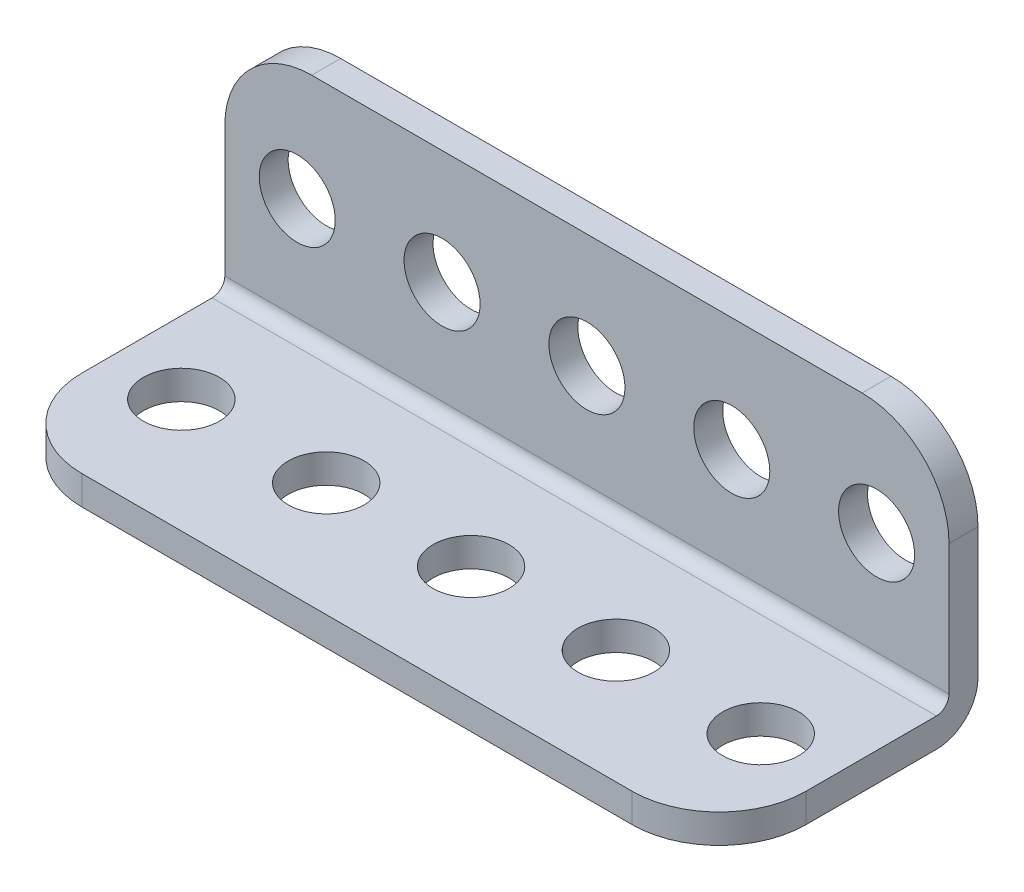
ISO-10303-21;
HEADER;
FILE_DESCRIPTION(('STEP AP214'),'2;1');
FILE_NAME('part.step','',(''),(''),'','','');
FILE_SCHEMA(('AUTOMOTIVE_DESIGN { 1 0 10303 214 1 1 1 1 }'));
ENDSEC;
DATA;
#1=APPLICATION_CONTEXT('core data for automotive mechanical design processes');
#2=APPLICATION_PROTOCOL_DEFINITION('international standard','automotive_design',2000,#1);
#3=PRODUCT_CONTEXT('',#1,'mechanical');
#4=PRODUCT('Part','Part','',(#3));
#5=PRODUCT_RELATED_PRODUCT_CATEGORY('part','',(#4));
#6=PRODUCT_DEFINITION_FORMATION('','',#4);
#7=PRODUCT_DEFINITION_CONTEXT('part definition',#1,'design');
#8=PRODUCT_DEFINITION('design','',#6,#7);
#9=PRODUCT_DEFINITION_SHAPE('','',#8);
#10=(LENGTH_UNIT() NAMED_UNIT(*) SI_UNIT(.MILLI.,.METRE.));
#11=(NAMED_UNIT(*) PLANE_ANGLE_UNIT() SI_UNIT($,.RADIAN.));
#12=(NAMED_UNIT(*) SI_UNIT($,.STERADIAN.) SOLID_ANGLE_UNIT());
#13=UNCERTAINTY_MEASURE_WITH_UNIT(LENGTH_MEASURE(1.E-05),#10,'distance_accuracy_value','');
#14=(GEOMETRIC_REPRESENTATION_CONTEXT(3) GLOBAL_UNCERTAINTY_ASSIGNED_CONTEXT((#13)) GLOBAL_UNIT_ASSIGNED_CONTEXT((#10,
#11,#12)) REPRESENTATION_CONTEXT('',''));
#15=CARTESIAN_POINT('',(0.,0.,0.));
#16=DIRECTION('',(0.,0.,1.));
#17=DIRECTION('',(1.,0.,0.));
#18=AXIS2_PLACEMENT_3D('',#15,#16,#17);
#19=CARTESIAN_POINT('',(35.2,7.9,-14.3));
#20=DIRECTION('',(0.,0.,1.));
#21=DIRECTION('',(0.,-1.,0.));
#22=AXIS2_PLACEMENT_3D('',#19,#20,#21);
#23=CYLINDRICAL_SURFACE('',#22,4.8);
#24=CARTESIAN_POINT('',(35.2,7.9,-14.3));
#25=DIRECTION('',(0.,0.,1.));
#26=DIRECTION('',(0.,-1.,0.));
#27=AXIS2_PLACEMENT_3D('',#24,#25,#26);
#28=CIRCLE('',#27,4.8);
#29=CARTESIAN_POINT('',(40.,7.9,-14.3));
#30=VERTEX_POINT('',#29);
#31=CARTESIAN_POINT('',(35.2,12.7,-14.3));
#32=VERTEX_POINT('',#31);
#33=EDGE_CURVE('E17',#30,#32,#28,.T.);
#34=ORIENTED_EDGE('',*,*,#33,.T.);
#35=DIRECTION('',(0.,0.,-1.));
#36=VECTOR('',#35,1.);
#37=CARTESIAN_POINT('',(35.2,12.7,-14.3));
#38=LINE('',#37,#36);
#39=CARTESIAN_POINT('',(35.2,12.7,-12.7));
#40=VERTEX_POINT('',#39);
#41=EDGE_CURVE('E107',#32,#40,#38,.F.);
#42=ORIENTED_EDGE('',*,*,#41,.T.);
#43=CARTESIAN_POINT('',(35.2,7.90000000000001,-12.7));
#44=DIRECTION('',(0.,0.,1.));
#45=DIRECTION('',(0.,-1.,0.));
#46=AXIS2_PLACEMENT_3D('',#43,#44,#45);
#47=CIRCLE('',#46,4.8);
#48=CARTESIAN_POINT('',(40.,7.90000000000001,-12.7));
#49=VERTEX_POINT('',#48);
#50=EDGE_CURVE('E103',#49,#40,#47,.T.);
#51=ORIENTED_EDGE('',*,*,#50,.F.);
#52=DIRECTION('',(0.,0.,1.));
#53=VECTOR('',#52,1.);
#54=CARTESIAN_POINT('',(40.,7.9,-14.3));
#55=LINE('',#54,#53);
#56=EDGE_CURVE('E100',#49,#30,#55,.F.);
#57=ORIENTED_EDGE('',*,*,#56,.T.);
#58=EDGE_LOOP('',(#34,#42,#51,#57));
#59=FACE_BOUND('',#58,.T.);
#60=ADVANCED_FACE('F14',(#59),#23,.T.);
#61=CARTESIAN_POINT('',(40.,12.7,-14.3));
#62=DIRECTION('',(0.,-1.,0.));
#63=DIRECTION('',(0.,0.,-1.));
#64=AXIS2_PLACEMENT_3D('',#61,#62,#63);
#65=PLANE('',#64);
#66=DIRECTION('',(1.,0.,0.));
#67=VECTOR('',#66,1.);
#68=CARTESIAN_POINT('',(0.,12.7,-12.7));
#69=LINE('',#68,#67);
#70=CARTESIAN_POINT('',(4.8,12.7,-12.7));
#71=VERTEX_POINT('',#70);
#72=EDGE_CURVE('E156',#40,#71,#69,.F.);
#73=ORIENTED_EDGE('',*,*,#72,.F.);
#74=ORIENTED_EDGE('',*,*,#41,.F.);
#75=DIRECTION('',(1.,0.,0.));
#76=VECTOR('',#75,1.);
#77=CARTESIAN_POINT('',(0.,12.7,-14.3));
#78=LINE('',#77,#76);
#79=CARTESIAN_POINT('',(4.8,12.7,-14.3));
#80=VERTEX_POINT('',#79);
#81=EDGE_CURVE('E116',#32,#80,#78,.F.);
#82=ORIENTED_EDGE('',*,*,#81,.T.);
#83=DIRECTION('',(0.,0.,1.));
#84=VECTOR('',#83,1.);
#85=CARTESIAN_POINT('',(4.8,12.7,-14.3));
#86=LINE('',#85,#84);
#87=EDGE_CURVE('E166',#71,#80,#86,.F.);
#88=ORIENTED_EDGE('',*,*,#87,.F.);
#89=EDGE_LOOP('',(#73,#74,#82,#88));
#90=FACE_BOUND('',#89,.T.);
#91=ADVANCED_FACE('F290',(#90),#65,.F.);
#92=CARTESIAN_POINT('',(4.8,7.9,-14.3));
#93=DIRECTION('',(0.,0.,1.));
#94=DIRECTION('',(0.,-1.,0.));
#95=AXIS2_PLACEMENT_3D('',#92,#93,#94);
#96=CYLINDRICAL_SURFACE('',#95,4.8);
#97=CARTESIAN_POINT('',(4.8,7.9,-14.3));
#98=DIRECTION('',(0.,0.,1.));
#99=DIRECTION('',(0.,-1.,0.));
#100=AXIS2_PLACEMENT_3D('',#97,#98,#99);
#101=CIRCLE('',#100,4.8);
#102=CARTESIAN_POINT('',(0.,7.9,-14.3));
#103=VERTEX_POINT('',#102);
#104=EDGE_CURVE('E160',#80,#103,#101,.T.);
#105=ORIENTED_EDGE('',*,*,#104,.T.);
#106=DIRECTION('',(0.,0.,1.));
#107=VECTOR('',#106,1.);
#108=CARTESIAN_POINT('',(0.,7.9,-14.3));
#109=LINE('',#108,#107);
#110=CARTESIAN_POINT('',(0.,7.90000000000001,-12.7));
#111=VERTEX_POINT('',#110);
#112=EDGE_CURVE('E162',#103,#111,#109,.T.);
#113=ORIENTED_EDGE('',*,*,#112,.T.);
#114=CARTESIAN_POINT('',(4.8,7.90000000000001,-12.7));
#115=DIRECTION('',(0.,0.,1.));
#116=DIRECTION('',(0.,-1.,0.));
#117=AXIS2_PLACEMENT_3D('',#114,#115,#116);
#118=CIRCLE('',#117,4.8);
#119=EDGE_CURVE('E158',#71,#111,#118,.T.);
#120=ORIENTED_EDGE('',*,*,#119,.F.);
#121=ORIENTED_EDGE('',*,*,#87,.T.);
#122=EDGE_LOOP('',(#105,#113,#120,#121));
#123=FACE_BOUND('',#122,.T.);
#124=ADVANCED_FACE('F244',(#123),#96,.T.);
#125=CARTESIAN_POINT('',(4.,6.4,-22.7));
#126=DIRECTION('',(0.,0.,1.));
#127=DIRECTION('',(1.,0.,0.));
#128=AXIS2_PLACEMENT_3D('',#125,#126,#127);
#129=CYLINDRICAL_SURFACE('',#128,2.1);
#130=CARTESIAN_POINT('',(4.,6.4,-14.3));
#131=DIRECTION('',(0.,0.,1.));
#132=DIRECTION('',(1.,0.,0.));
#133=AXIS2_PLACEMENT_3D('',#130,#131,#132);
#134=CIRCLE('',#133,2.1);
#135=CARTESIAN_POINT('',(6.1,6.4,-14.3));
#136=VERTEX_POINT('',#135);
#137=EDGE_CURVE('E239',#136,#136,#134,.F.);
#138=ORIENTED_EDGE('',*,*,#137,.T.);
#139=EDGE_LOOP('',(#138));
#140=FACE_BOUND('',#139,.T.);
#141=CARTESIAN_POINT('',(4.,6.4,-12.7));
#142=DIRECTION('',(0.,0.,1.));
#143=DIRECTION('',(1.,0.,0.));
#144=AXIS2_PLACEMENT_3D('',#141,#142,#143);
#145=CIRCLE('',#144,2.1);
#146=CARTESIAN_POINT('',(6.1,6.4,-12.7));
#147=VERTEX_POINT('',#146);
#148=EDGE_CURVE('E221',#147,#147,#145,.F.);
#149=ORIENTED_EDGE('',*,*,#148,.F.);
#150=EDGE_LOOP('',(#149));
#151=FACE_BOUND('',#150,.T.);
#152=ADVANCED_FACE('F297',(#140,#151),#129,.F.);
#153=CARTESIAN_POINT('',(12.,6.4,-22.7));
#154=DIRECTION('',(0.,0.,1.));
#155=DIRECTION('',(1.,0.,0.));
#156=AXIS2_PLACEMENT_3D('',#153,#154,#155);
#157=CYLINDRICAL_SURFACE('',#156,2.1);
#158=CARTESIAN_POINT('',(12.,6.4,-14.3));
#159=DIRECTION('',(0.,0.,1.));
#160=DIRECTION('',(1.,0.,0.));
#161=AXIS2_PLACEMENT_3D('',#158,#159,#160);
#162=CIRCLE('',#161,2.1);
#163=CARTESIAN_POINT('',(14.1,6.4,-14.3));
#164=VERTEX_POINT('',#163);
#165=EDGE_CURVE('E236',#164,#164,#162,.F.);
#166=ORIENTED_EDGE('',*,*,#165,.T.);
#167=EDGE_LOOP('',(#166));
#168=FACE_BOUND('',#167,.T.);
#169=CARTESIAN_POINT('',(12.,6.4,-12.7));
#170=DIRECTION('',(0.,0.,1.));
#171=DIRECTION('',(1.,0.,0.));
#172=AXIS2_PLACEMENT_3D('',#169,#170,#171);
#173=CIRCLE('',#172,2.1);
#174=CARTESIAN_POINT('',(14.1,6.4,-12.7));
#175=VERTEX_POINT('',#174);
#176=EDGE_CURVE('E218',#175,#175,#173,.F.);
#177=ORIENTED_EDGE('',*,*,#176,.F.);
#178=EDGE_LOOP('',(#177));
#179=FACE_BOUND('',#178,.T.);
#180=ADVANCED_FACE('F363',(#168,#179),#157,.F.);
#181=CARTESIAN_POINT('',(36.,6.4,-22.7));
#182=DIRECTION('',(0.,0.,1.));
#183=DIRECTION('',(1.,0.,0.));
#184=AXIS2_PLACEMENT_3D('',#181,#182,#183);
#185=CYLINDRICAL_SURFACE('',#184,2.1);
#186=CARTESIAN_POINT('',(36.,6.4,-14.3));
#187=DIRECTION('',(0.,0.,1.));
#188=DIRECTION('',(1.,0.,0.));
#189=AXIS2_PLACEMENT_3D('',#186,#187,#188);
#190=CIRCLE('',#189,2.1);
#191=CARTESIAN_POINT('',(38.1,6.4,-14.3));
#192=VERTEX_POINT('',#191);
#193=EDGE_CURVE('E233',#192,#192,#190,.F.);
#194=ORIENTED_EDGE('',*,*,#193,.T.);
#195=EDGE_LOOP('',(#194));
#196=FACE_BOUND('',#195,.T.);
#197=CARTESIAN_POINT('',(36.,6.4,-12.7));
#198=DIRECTION('',(0.,0.,1.));
#199=DIRECTION('',(1.,0.,0.));
#200=AXIS2_PLACEMENT_3D('',#197,#198,#199);
#201=CIRCLE('',#200,2.1);
#202=CARTESIAN_POINT('',(38.1,6.4,-12.7));
#203=VERTEX_POINT('',#202);
#204=EDGE_CURVE('E215',#203,#203,#201,.F.);
#205=ORIENTED_EDGE('',*,*,#204,.F.);
#206=EDGE_LOOP('',(#205));
#207=FACE_BOUND('',#206,.T.);
#208=ADVANCED_FACE('F359',(#196,#207),#185,.F.);
#209=CARTESIAN_POINT('',(28.,6.4,-22.7));
#210=DIRECTION('',(0.,0.,1.));
#211=DIRECTION('',(1.,0.,0.));
#212=AXIS2_PLACEMENT_3D('',#209,#210,#211);
#213=CYLINDRICAL_SURFACE('',#212,2.1);
#214=CARTESIAN_POINT('',(28.,6.4,-14.3));
#215=DIRECTION('',(0.,0.,1.));
#216=DIRECTION('',(1.,0.,0.));
#217=AXIS2_PLACEMENT_3D('',#214,#215,#216);
#218=CIRCLE('',#217,2.1);
#219=CARTESIAN_POINT('',(30.1,6.4,-14.3));
#220=VERTEX_POINT('',#219);
#221=EDGE_CURVE('E230',#220,#220,#218,.F.);
#222=ORIENTED_EDGE('',*,*,#221,.T.);
#223=EDGE_LOOP('',(#222));
#224=FACE_BOUND('',#223,.T.);
#225=CARTESIAN_POINT('',(28.,6.4,-12.7));
#226=DIRECTION('',(0.,0.,1.));
#227=DIRECTION('',(1.,0.,0.));
#228=AXIS2_PLACEMENT_3D('',#225,#226,#227);
#229=CIRCLE('',#228,2.1);
#230=CARTESIAN_POINT('',(30.1,6.4,-12.7));
#231=VERTEX_POINT('',#230);
#232=EDGE_CURVE('E212',#231,#231,#229,.F.);
#233=ORIENTED_EDGE('',*,*,#232,.F.);
#234=EDGE_LOOP('',(#233));
#235=FACE_BOUND('',#234,.T.);
#236=ADVANCED_FACE('F355',(#224,#235),#213,.F.);
#237=CARTESIAN_POINT('',(20.,6.4,-22.7));
#238=DIRECTION('',(0.,0.,1.));
#239=DIRECTION('',(1.,0.,0.));
#240=AXIS2_PLACEMENT_3D('',#237,#238,#239);
#241=CYLINDRICAL_SURFACE('',#240,2.1);
#242=CARTESIAN_POINT('',(20.,6.4,-14.3));
#243=DIRECTION('',(0.,0.,1.));
#244=DIRECTION('',(1.,0.,0.));
#245=AXIS2_PLACEMENT_3D('',#242,#243,#244);
#246=CIRCLE('',#245,2.1);
#247=CARTESIAN_POINT('',(22.1,6.4,-14.3));
#248=VERTEX_POINT('',#247);
#249=EDGE_CURVE('E227',#248,#248,#246,.F.);
#250=ORIENTED_EDGE('',*,*,#249,.T.);
#251=EDGE_LOOP('',(#250));
#252=FACE_BOUND('',#251,.T.);
#253=CARTESIAN_POINT('',(20.,6.4,-12.7));
#254=DIRECTION('',(0.,0.,1.));
#255=DIRECTION('',(1.,0.,0.));
#256=AXIS2_PLACEMENT_3D('',#253,#254,#255);
#257=CIRCLE('',#256,2.1);
#258=CARTESIAN_POINT('',(22.1,6.4,-12.7));
#259=VERTEX_POINT('',#258);
#260=EDGE_CURVE('E164',#259,#259,#257,.F.);
#261=ORIENTED_EDGE('',*,*,#260,.F.);
#262=EDGE_LOOP('',(#261));
#263=FACE_BOUND('',#262,.T.);
#264=ADVANCED_FACE('F352',(#252,#263),#241,.F.);
#265=CARTESIAN_POINT('',(0.,0.699999999999994,-12.));
#266=DIRECTION('',(-1.,0.,0.));
#267=DIRECTION('',(0.,0.,1.));
#268=AXIS2_PLACEMENT_3D('',#265,#266,#267);
#269=CYLINDRICAL_SURFACE('',#268,2.3);
#270=DIRECTION('',(1.,0.,0.));
#271=VECTOR('',#270,1.);
#272=CARTESIAN_POINT('',(0.,-1.6,-12.));
#273=LINE('',#272,#271);
#274=CARTESIAN_POINT('',(0.,-1.6,-12.));
#275=VERTEX_POINT('',#274);
#276=CARTESIAN_POINT('',(40.,-1.6,-12.));
#277=VERTEX_POINT('',#276);
#278=EDGE_CURVE('E149',#275,#277,#273,.T.);
#279=ORIENTED_EDGE('',*,*,#278,.F.);
#280=CARTESIAN_POINT('',(0.,0.699999999999994,-12.));
#281=DIRECTION('',(-1.,0.,0.));
#282=DIRECTION('',(0.,0.,1.));
#283=AXIS2_PLACEMENT_3D('',#280,#281,#282);
#284=CIRCLE('',#283,2.3);
#285=CARTESIAN_POINT('',(0.,0.699999999999997,-14.3));
#286=VERTEX_POINT('',#285);
#287=EDGE_CURVE('E142',#286,#275,#284,.T.);
#288=ORIENTED_EDGE('',*,*,#287,.F.);
#289=DIRECTION('',(1.,0.,0.));
#290=VECTOR('',#289,1.);
#291=CARTESIAN_POINT('',(0.,0.7,-14.3));
#292=LINE('',#291,#290);
#293=CARTESIAN_POINT('',(40.,0.699999999999997,-14.3));
#294=VERTEX_POINT('',#293);
#295=EDGE_CURVE('E117',#286,#294,#292,.T.);
#296=ORIENTED_EDGE('',*,*,#295,.T.);
#297=CARTESIAN_POINT('',(40.,0.699999999999994,-12.));
#298=DIRECTION('',(-1.,0.,0.));
#299=DIRECTION('',(0.,0.,1.));
#300=AXIS2_PLACEMENT_3D('',#297,#298,#299);
#301=CIRCLE('',#300,2.3);
#302=EDGE_CURVE('E122',#277,#294,#301,.F.);
#303=ORIENTED_EDGE('',*,*,#302,.F.);
#304=EDGE_LOOP('',(#279,#288,#296,#303));
#305=FACE_BOUND('',#304,.T.);
#306=ADVANCED_FACE('F252',(#305),#269,.T.);
#307=CARTESIAN_POINT('',(0.,0.,-14.3));
#308=DIRECTION('',(0.,0.,1.));
#309=DIRECTION('',(0.,-1.,0.));
#310=AXIS2_PLACEMENT_3D('',#307,#308,#309);
#311=PLANE('',#310);
#312=ORIENTED_EDGE('',*,*,#249,.F.);
#313=EDGE_LOOP('',(#312));
#314=FACE_BOUND('',#313,.T.);
#315=ORIENTED_EDGE('',*,*,#221,.F.);
#316=EDGE_LOOP('',(#315));
#317=FACE_BOUND('',#316,.T.);
#318=ORIENTED_EDGE('',*,*,#193,.F.);
#319=EDGE_LOOP('',(#318));
#320=FACE_BOUND('',#319,.T.);
#321=ORIENTED_EDGE('',*,*,#165,.F.);
#322=EDGE_LOOP('',(#321));
#323=FACE_BOUND('',#322,.T.);
#324=ORIENTED_EDGE('',*,*,#137,.F.);
#325=EDGE_LOOP('',(#324));
#326=FACE_BOUND('',#325,.T.);
#327=ORIENTED_EDGE('',*,*,#81,.F.);
#328=ORIENTED_EDGE('',*,*,#33,.F.);
#329=DIRECTION('',(0.,1.,0.));
#330=VECTOR('',#329,1.);
#331=CARTESIAN_POINT('',(40.,-1.6,-14.3));
#332=LINE('',#331,#330);
#333=EDGE_CURVE('E113',#294,#30,#332,.T.);
#334=ORIENTED_EDGE('',*,*,#333,.F.);
#335=ORIENTED_EDGE('',*,*,#295,.F.);
#336=DIRECTION('',(0.,1.,0.));
#337=VECTOR('',#336,1.);
#338=CARTESIAN_POINT('',(0.,-1.6,-14.3));
#339=LINE('',#338,#337);
#340=EDGE_CURVE('E143',#103,#286,#339,.F.);
#341=ORIENTED_EDGE('',*,*,#340,.F.);
#342=ORIENTED_EDGE('',*,*,#104,.F.);
#343=EDGE_LOOP('',(#327,#328,#334,#335,#341,#342));
#344=FACE_BOUND('',#343,.T.);
#345=ADVANCED_FACE('F112',(#314,#317,#320,#323,#326,#344),#311,.F.);
#346=CARTESIAN_POINT('',(0.,0.,-12.7));
#347=DIRECTION('',(0.,0.,1.));
#348=DIRECTION('',(0.,-1.,0.));
#349=AXIS2_PLACEMENT_3D('',#346,#347,#348);
#350=PLANE('',#349);
#351=ORIENTED_EDGE('',*,*,#260,.T.);
#352=EDGE_LOOP('',(#351));
#353=FACE_BOUND('',#352,.T.);
#354=ORIENTED_EDGE('',*,*,#232,.T.);
#355=EDGE_LOOP('',(#354));
#356=FACE_BOUND('',#355,.T.);
#357=ORIENTED_EDGE('',*,*,#204,.T.);
#358=EDGE_LOOP('',(#357));
#359=FACE_BOUND('',#358,.T.);
#360=ORIENTED_EDGE('',*,*,#176,.T.);
#361=EDGE_LOOP('',(#360));
#362=FACE_BOUND('',#361,.T.);
#363=ORIENTED_EDGE('',*,*,#148,.T.);
#364=EDGE_LOOP('',(#363));
#365=FACE_BOUND('',#364,.T.);
#366=DIRECTION('',(0.,1.,0.));
#367=VECTOR('',#366,1.);
#368=CARTESIAN_POINT('',(0.,-1.6,-12.7));
#369=LINE('',#368,#367);
#370=CARTESIAN_POINT('',(0.,0.699999999999992,-12.7));
#371=VERTEX_POINT('',#370);
#372=EDGE_CURVE('E146',#371,#111,#369,.T.);
#373=ORIENTED_EDGE('',*,*,#372,.F.);
#374=DIRECTION('',(-1.,0.,0.));
#375=VECTOR('',#374,1.);
#376=CARTESIAN_POINT('',(0.,0.699999999999991,-12.7));
#377=LINE('',#376,#375);
#378=CARTESIAN_POINT('',(40.,0.699999999999992,-12.7));
#379=VERTEX_POINT('',#378);
#380=EDGE_CURVE('E133',#371,#379,#377,.F.);
#381=ORIENTED_EDGE('',*,*,#380,.T.);
#382=DIRECTION('',(0.,1.,0.));
#383=VECTOR('',#382,1.);
#384=CARTESIAN_POINT('',(40.,-1.6,-12.7));
#385=LINE('',#384,#383);
#386=EDGE_CURVE('E124',#49,#379,#385,.F.);
#387=ORIENTED_EDGE('',*,*,#386,.F.);
#388=ORIENTED_EDGE('',*,*,#50,.T.);
#389=ORIENTED_EDGE('',*,*,#72,.T.);
#390=ORIENTED_EDGE('',*,*,#119,.T.);
#391=EDGE_LOOP('',(#373,#381,#387,#388,#389,#390));
#392=FACE_BOUND('',#391,.T.);
#393=ADVANCED_FACE('F286',(#353,#356,#359,#362,#365,#392),#350,.T.);
#394=CARTESIAN_POINT('',(0.,-1.6,0.));
#395=DIRECTION('',(0.,-1.,0.));
#396=DIRECTION('',(0.,0.,-1.));
#397=AXIS2_PLACEMENT_3D('',#394,#395,#396);
#398=PLANE('',#397);
#399=CARTESIAN_POINT('',(20.,-1.6,-6.30000000000005));
#400=DIRECTION('',(0.,1.,0.));
#401=DIRECTION('',(0.,0.,1.));
#402=AXIS2_PLACEMENT_3D('',#399,#400,#401);
#403=CIRCLE('',#402,2.1);
#404=CARTESIAN_POINT('',(20.,-1.6,-4.20000000000005));
#405=VERTEX_POINT('',#404);
#406=EDGE_CURVE('E186',#405,#405,#403,.T.);
#407=ORIENTED_EDGE('',*,*,#406,.T.);
#408=EDGE_LOOP('',(#407));
#409=FACE_BOUND('',#408,.T.);
#410=CARTESIAN_POINT('',(28.,-1.6,-6.30000000000005));
#411=DIRECTION('',(0.,1.,0.));
#412=DIRECTION('',(0.,0.,1.));
#413=AXIS2_PLACEMENT_3D('',#410,#411,#412);
#414=CIRCLE('',#413,2.1);
#415=CARTESIAN_POINT('',(28.,-1.6,-4.20000000000005));
#416=VERTEX_POINT('',#415);
#417=EDGE_CURVE('E189',#416,#416,#414,.T.);
#418=ORIENTED_EDGE('',*,*,#417,.T.);
#419=EDGE_LOOP('',(#418));
#420=FACE_BOUND('',#419,.T.);
#421=CARTESIAN_POINT('',(36.,-1.6,-6.30000000000005));
#422=DIRECTION('',(0.,1.,0.));
#423=DIRECTION('',(0.,0.,1.));
#424=AXIS2_PLACEMENT_3D('',#421,#422,#423);
#425=CIRCLE('',#424,2.1);
#426=CARTESIAN_POINT('',(36.,-1.6,-4.20000000000005));
#427=VERTEX_POINT('',#426);
#428=EDGE_CURVE('E192',#427,#427,#425,.T.);
#429=ORIENTED_EDGE('',*,*,#428,.T.);
#430=EDGE_LOOP('',(#429));
#431=FACE_BOUND('',#430,.T.);
#432=CARTESIAN_POINT('',(12.,-1.6,-6.30000000000005));
#433=DIRECTION('',(0.,1.,0.));
#434=DIRECTION('',(0.,0.,1.));
#435=AXIS2_PLACEMENT_3D('',#432,#433,#434);
#436=CIRCLE('',#435,2.1);
#437=CARTESIAN_POINT('',(12.,-1.6,-4.20000000000005));
#438=VERTEX_POINT('',#437);
#439=EDGE_CURVE('E195',#438,#438,#436,.T.);
#440=ORIENTED_EDGE('',*,*,#439,.T.);
#441=EDGE_LOOP('',(#440));
#442=FACE_BOUND('',#441,.T.);
#443=CARTESIAN_POINT('',(4.,-1.6,-6.30000000000005));
#444=DIRECTION('',(0.,1.,0.));
#445=DIRECTION('',(0.,0.,1.));
#446=AXIS2_PLACEMENT_3D('',#443,#444,#445);
#447=CIRCLE('',#446,2.1);
#448=CARTESIAN_POINT('',(4.,-1.6,-4.20000000000005));
#449=VERTEX_POINT('',#448);
#450=EDGE_CURVE('E198',#449,#449,#447,.T.);
#451=ORIENTED_EDGE('',*,*,#450,.T.);
#452=EDGE_LOOP('',(#451));
#453=FACE_BOUND('',#452,.T.);
#454=DIRECTION('',(0.,0.,1.));
#455=VECTOR('',#454,1.);
#456=CARTESIAN_POINT('',(0.,-1.6,0.));
#457=LINE('',#456,#455);
#458=CARTESIAN_POINT('',(0.,-1.6,-4.8));
#459=VERTEX_POINT('',#458);
#460=EDGE_CURVE('E139',#275,#459,#457,.T.);
#461=ORIENTED_EDGE('',*,*,#460,.F.);
#462=ORIENTED_EDGE('',*,*,#278,.T.);
#463=DIRECTION('',(0.,0.,-1.));
#464=VECTOR('',#463,1.);
#465=CARTESIAN_POINT('',(40.,-1.6,0.));
#466=LINE('',#465,#464);
#467=CARTESIAN_POINT('',(40.,-1.6,-4.8));
#468=VERTEX_POINT('',#467);
#469=EDGE_CURVE('E128',#468,#277,#466,.T.);
#470=ORIENTED_EDGE('',*,*,#469,.F.);
#471=CARTESIAN_POINT('',(35.2,-1.6,-4.8));
#472=DIRECTION('',(0.,1.,0.));
#473=DIRECTION('',(0.,0.,1.));
#474=AXIS2_PLACEMENT_3D('',#471,#472,#473);
#475=CIRCLE('',#474,4.8);
#476=CARTESIAN_POINT('',(35.2,-1.6,0.));
#477=VERTEX_POINT('',#476);
#478=EDGE_CURVE('E204',#477,#468,#475,.T.);
#479=ORIENTED_EDGE('',*,*,#478,.F.);
#480=DIRECTION('',(1.,0.,0.));
#481=VECTOR('',#480,1.);
#482=CARTESIAN_POINT('',(0.,-1.6,0.));
#483=LINE('',#482,#481);
#484=CARTESIAN_POINT('',(4.8,-1.6,0.));
#485=VERTEX_POINT('',#484);
#486=EDGE_CURVE('E150',#485,#477,#483,.T.);
#487=ORIENTED_EDGE('',*,*,#486,.F.);
#488=CARTESIAN_POINT('',(4.8,-1.6,-4.8));
#489=DIRECTION('',(0.,1.,0.));
#490=DIRECTION('',(0.,0.,1.));
#491=AXIS2_PLACEMENT_3D('',#488,#489,#490);
#492=CIRCLE('',#491,4.8);
#493=EDGE_CURVE('E201',#459,#485,#492,.T.);
#494=ORIENTED_EDGE('',*,*,#493,.F.);
#495=EDGE_LOOP('',(#461,#462,#470,#479,#487,#494));
#496=FACE_BOUND('',#495,.T.);
#497=ADVANCED_FACE('F257',(#409,#420,#431,#442,#453,#496),#398,.T.);
#498=CARTESIAN_POINT('',(0.,-1.6,0.));
#499=DIRECTION('',(-1.,0.,0.));
#500=DIRECTION('',(0.,0.,1.));
#501=AXIS2_PLACEMENT_3D('',#498,#499,#500);
#502=PLANE('',#501);
#503=ORIENTED_EDGE('',*,*,#460,.T.);
#504=DIRECTION('',(0.,1.,0.));
#505=VECTOR('',#504,1.);
#506=CARTESIAN_POINT('',(0.,-1.6,-4.8));
#507=LINE('',#506,#505);
#508=CARTESIAN_POINT('',(0.,0.,-4.8));
#509=VERTEX_POINT('',#508);
#510=EDGE_CURVE('E203',#509,#459,#507,.F.);
#511=ORIENTED_EDGE('',*,*,#510,.F.);
#512=DIRECTION('',(0.,0.,-1.));
#513=VECTOR('',#512,1.);
#514=CARTESIAN_POINT('',(0.,0.,0.));
#515=LINE('',#514,#513);
#516=CARTESIAN_POINT('',(0.,0.,-12.));
#517=VERTEX_POINT('',#516);
#518=EDGE_CURVE('E138',#509,#517,#515,.T.);
#519=ORIENTED_EDGE('',*,*,#518,.T.);
#520=CARTESIAN_POINT('',(0.,0.699999999999994,-12.));
#521=DIRECTION('',(-1.,0.,0.));
#522=DIRECTION('',(0.,0.,1.));
#523=AXIS2_PLACEMENT_3D('',#520,#521,#522);
#524=CIRCLE('',#523,0.700000000000001);
#525=EDGE_CURVE('E141',#517,#371,#524,.F.);
#526=ORIENTED_EDGE('',*,*,#525,.T.);
#527=ORIENTED_EDGE('',*,*,#372,.T.);
#528=ORIENTED_EDGE('',*,*,#112,.F.);
#529=ORIENTED_EDGE('',*,*,#340,.T.);
#530=ORIENTED_EDGE('',*,*,#287,.T.);
#531=EDGE_LOOP('',(#503,#511,#519,#526,#527,#528,#529,#530));
#532=FACE_BOUND('',#531,.T.);
#533=ADVANCED_FACE('F249',(#532),#502,.T.);
#534=CARTESIAN_POINT('',(0.,0.699999999999994,-12.));
#535=DIRECTION('',(-1.,0.,0.));
#536=DIRECTION('',(0.,0.,1.));
#537=AXIS2_PLACEMENT_3D('',#534,#535,#536);
#538=CYLINDRICAL_SURFACE('',#537,0.700000000000001);
#539=ORIENTED_EDGE('',*,*,#380,.F.);
#540=ORIENTED_EDGE('',*,*,#525,.F.);
#541=DIRECTION('',(1.,0.,0.));
#542=VECTOR('',#541,1.);
#543=CARTESIAN_POINT('',(0.,0.,-12.));
#544=LINE('',#543,#542);
#545=CARTESIAN_POINT('',(40.,0.,-12.));
#546=VERTEX_POINT('',#545);
#547=EDGE_CURVE('E134',#517,#546,#544,.T.);
#548=ORIENTED_EDGE('',*,*,#547,.T.);
#549=CARTESIAN_POINT('',(40.,0.699999999999994,-12.));
#550=DIRECTION('',(-1.,0.,0.));
#551=DIRECTION('',(0.,0.,1.));
#552=AXIS2_PLACEMENT_3D('',#549,#550,#551);
#553=CIRCLE('',#552,0.700000000000001);
#554=EDGE_CURVE('E126',#379,#546,#553,.T.);
#555=ORIENTED_EDGE('',*,*,#554,.F.);
#556=EDGE_LOOP('',(#539,#540,#548,#555));
#557=FACE_BOUND('',#556,.T.);
#558=ADVANCED_FACE('F284',(#557),#538,.F.);
#559=CARTESIAN_POINT('',(40.,-1.6,0.));
#560=DIRECTION('',(1.,0.,0.));
#561=DIRECTION('',(0.,0.,-1.));
#562=AXIS2_PLACEMENT_3D('',#559,#560,#561);
#563=PLANE('',#562);
#564=DIRECTION('',(0.,0.,-1.));
#565=VECTOR('',#564,1.);
#566=CARTESIAN_POINT('',(40.,0.,0.));
#567=LINE('',#566,#565);
#568=CARTESIAN_POINT('',(40.,0.,-4.8));
#569=VERTEX_POINT('',#568);
#570=EDGE_CURVE('E137',#546,#569,#567,.F.);
#571=ORIENTED_EDGE('',*,*,#570,.T.);
#572=DIRECTION('',(0.,1.,0.));
#573=VECTOR('',#572,1.);
#574=CARTESIAN_POINT('',(40.,-1.6,-4.8));
#575=LINE('',#574,#573);
#576=EDGE_CURVE('E153',#468,#569,#575,.T.);
#577=ORIENTED_EDGE('',*,*,#576,.F.);
#578=ORIENTED_EDGE('',*,*,#469,.T.);
#579=ORIENTED_EDGE('',*,*,#302,.T.);
#580=ORIENTED_EDGE('',*,*,#333,.T.);
#581=ORIENTED_EDGE('',*,*,#56,.F.);
#582=ORIENTED_EDGE('',*,*,#386,.T.);
#583=ORIENTED_EDGE('',*,*,#554,.T.);
#584=EDGE_LOOP('',(#571,#577,#578,#579,#580,#581,#582,#583));
#585=FACE_BOUND('',#584,.T.);
#586=ADVANCED_FACE('F119',(#585),#563,.T.);
#587=CARTESIAN_POINT('',(35.2,-1.6,-4.8));
#588=DIRECTION('',(0.,1.,0.));
#589=DIRECTION('',(0.,0.,1.));
#590=AXIS2_PLACEMENT_3D('',#587,#588,#589);
#591=CYLINDRICAL_SURFACE('',#590,4.8);
#592=ORIENTED_EDGE('',*,*,#478,.T.);
#593=ORIENTED_EDGE('',*,*,#576,.T.);
#594=CARTESIAN_POINT('',(35.2,0.,-4.8));
#595=DIRECTION('',(0.,1.,0.));
#596=DIRECTION('',(0.,0.,1.));
#597=AXIS2_PLACEMENT_3D('',#594,#595,#596);
#598=CIRCLE('',#597,4.8);
#599=CARTESIAN_POINT('',(35.2,0.,0.));
#600=VERTEX_POINT('',#599);
#601=EDGE_CURVE('E183',#569,#600,#598,.F.);
#602=ORIENTED_EDGE('',*,*,#601,.T.);
#603=DIRECTION('',(0.,1.,0.));
#604=VECTOR('',#603,1.);
#605=CARTESIAN_POINT('',(35.2,-1.6,0.));
#606=LINE('',#605,#604);
#607=EDGE_CURVE('E152',#477,#600,#606,.T.);
#608=ORIENTED_EDGE('',*,*,#607,.F.);
#609=EDGE_LOOP('',(#592,#593,#602,#608));
#610=FACE_BOUND('',#609,.T.);
#611=ADVANCED_FACE('F270',(#610),#591,.T.);
#612=CARTESIAN_POINT('',(0.,-1.6,0.));
#613=DIRECTION('',(0.,0.,1.));
#614=DIRECTION('',(1.,0.,0.));
#615=AXIS2_PLACEMENT_3D('',#612,#613,#614);
#616=PLANE('',#615);
#617=DIRECTION('',(1.,0.,0.));
#618=VECTOR('',#617,1.);
#619=CARTESIAN_POINT('',(0.,0.,0.));
#620=LINE('',#619,#618);
#621=CARTESIAN_POINT('',(4.8,0.,0.));
#622=VERTEX_POINT('',#621);
#623=EDGE_CURVE('E182',#600,#622,#620,.F.);
#624=ORIENTED_EDGE('',*,*,#623,.T.);
#625=DIRECTION('',(0.,1.,0.));
#626=VECTOR('',#625,1.);
#627=CARTESIAN_POINT('',(4.8,-1.6,0.));
#628=LINE('',#627,#626);
#629=EDGE_CURVE('E32',#485,#622,#628,.T.);
#630=ORIENTED_EDGE('',*,*,#629,.F.);
#631=ORIENTED_EDGE('',*,*,#486,.T.);
#632=ORIENTED_EDGE('',*,*,#607,.T.);
#633=EDGE_LOOP('',(#624,#630,#631,#632));
#634=FACE_BOUND('',#633,.T.);
#635=ADVANCED_FACE('F329',(#634),#616,.T.);
#636=CARTESIAN_POINT('',(4.8,-1.6,-4.8));
#637=DIRECTION('',(0.,1.,0.));
#638=DIRECTION('',(0.,0.,1.));
#639=AXIS2_PLACEMENT_3D('',#636,#637,#638);
#640=CYLINDRICAL_SURFACE('',#639,4.8);
#641=ORIENTED_EDGE('',*,*,#493,.T.);
#642=ORIENTED_EDGE('',*,*,#629,.T.);
#643=CARTESIAN_POINT('',(4.8,0.,-4.8));
#644=DIRECTION('',(0.,1.,0.));
#645=DIRECTION('',(0.,0.,1.));
#646=AXIS2_PLACEMENT_3D('',#643,#644,#645);
#647=CIRCLE('',#646,4.8);
#648=EDGE_CURVE('E180',#622,#509,#647,.F.);
#649=ORIENTED_EDGE('',*,*,#648,.T.);
#650=ORIENTED_EDGE('',*,*,#510,.T.);
#651=EDGE_LOOP('',(#641,#642,#649,#650));
#652=FACE_BOUND('',#651,.T.);
#653=ADVANCED_FACE('F262',(#652),#640,.T.);
#654=CARTESIAN_POINT('',(4.,-10.,-6.30000000000005));
#655=DIRECTION('',(0.,1.,0.));
#656=DIRECTION('',(0.,0.,1.));
#657=AXIS2_PLACEMENT_3D('',#654,#655,#656);
#658=CYLINDRICAL_SURFACE('',#657,2.1);
#659=ORIENTED_EDGE('',*,*,#450,.F.);
#660=EDGE_LOOP('',(#659));
#661=FACE_BOUND('',#660,.T.);
#662=CARTESIAN_POINT('',(4.,0.,-6.30000000000005));
#663=DIRECTION('',(0.,1.,0.));
#664=DIRECTION('',(0.,0.,1.));
#665=AXIS2_PLACEMENT_3D('',#662,#663,#664);
#666=CIRCLE('',#665,2.1);
#667=CARTESIAN_POINT('',(4.,0.,-4.20000000000005));
#668=VERTEX_POINT('',#667);
#669=EDGE_CURVE('E177',#668,#668,#666,.T.);
#670=ORIENTED_EDGE('',*,*,#669,.T.);
#671=EDGE_LOOP('',(#670));
#672=FACE_BOUND('',#671,.T.);
#673=ADVANCED_FACE('F322',(#661,#672),#658,.F.);
#674=CARTESIAN_POINT('',(12.,-10.,-6.30000000000005));
#675=DIRECTION('',(0.,1.,0.));
#676=DIRECTION('',(0.,0.,1.));
#677=AXIS2_PLACEMENT_3D('',#674,#675,#676);
#678=CYLINDRICAL_SURFACE('',#677,2.1);
#679=ORIENTED_EDGE('',*,*,#439,.F.);
#680=EDGE_LOOP('',(#679));
#681=FACE_BOUND('',#680,.T.);
#682=CARTESIAN_POINT('',(12.,0.,-6.30000000000005));
#683=DIRECTION('',(0.,1.,0.));
#684=DIRECTION('',(0.,0.,1.));
#685=AXIS2_PLACEMENT_3D('',#682,#683,#684);
#686=CIRCLE('',#685,2.1);
#687=CARTESIAN_POINT('',(12.,0.,-4.20000000000005));
#688=VERTEX_POINT('',#687);
#689=EDGE_CURVE('E174',#688,#688,#686,.T.);
#690=ORIENTED_EDGE('',*,*,#689,.T.);
#691=EDGE_LOOP('',(#690));
#692=FACE_BOUND('',#691,.T.);
#693=ADVANCED_FACE('F318',(#681,#692),#678,.F.);
#694=CARTESIAN_POINT('',(36.,-10.,-6.30000000000005));
#695=DIRECTION('',(0.,1.,0.));
#696=DIRECTION('',(0.,0.,1.));
#697=AXIS2_PLACEMENT_3D('',#694,#695,#696);
#698=CYLINDRICAL_SURFACE('',#697,2.1);
#699=ORIENTED_EDGE('',*,*,#428,.F.);
#700=EDGE_LOOP('',(#699));
#701=FACE_BOUND('',#700,.T.);
#702=CARTESIAN_POINT('',(36.,0.,-6.30000000000005));
#703=DIRECTION('',(0.,1.,0.));
#704=DIRECTION('',(0.,0.,1.));
#705=AXIS2_PLACEMENT_3D('',#702,#703,#704);
#706=CIRCLE('',#705,2.1);
#707=CARTESIAN_POINT('',(36.,0.,-4.20000000000005));
#708=VERTEX_POINT('',#707);
#709=EDGE_CURVE('E171',#708,#708,#706,.T.);
#710=ORIENTED_EDGE('',*,*,#709,.T.);
#711=EDGE_LOOP('',(#710));
#712=FACE_BOUND('',#711,.T.);
#713=ADVANCED_FACE('F314',(#701,#712),#698,.F.);
#714=CARTESIAN_POINT('',(28.,-10.,-6.30000000000005));
#715=DIRECTION('',(0.,1.,0.));
#716=DIRECTION('',(0.,0.,1.));
#717=AXIS2_PLACEMENT_3D('',#714,#715,#716);
#718=CYLINDRICAL_SURFACE('',#717,2.1);
#719=ORIENTED_EDGE('',*,*,#417,.F.);
#720=EDGE_LOOP('',(#719));
#721=FACE_BOUND('',#720,.T.);
#722=CARTESIAN_POINT('',(28.,0.,-6.30000000000005));
#723=DIRECTION('',(0.,1.,0.));
#724=DIRECTION('',(0.,0.,1.));
#725=AXIS2_PLACEMENT_3D('',#722,#723,#724);
#726=CIRCLE('',#725,2.1);
#727=CARTESIAN_POINT('',(28.,0.,-4.20000000000005));
#728=VERTEX_POINT('',#727);
#729=EDGE_CURVE('E23',#728,#728,#726,.T.);
#730=ORIENTED_EDGE('',*,*,#729,.T.);
#731=EDGE_LOOP('',(#730));
#732=FACE_BOUND('',#731,.T.);
#733=ADVANCED_FACE('F306',(#721,#732),#718,.F.);
#734=CARTESIAN_POINT('',(20.,-10.,-6.30000000000005));
#735=DIRECTION('',(0.,1.,0.));
#736=DIRECTION('',(0.,0.,1.));
#737=AXIS2_PLACEMENT_3D('',#734,#735,#736);
#738=CYLINDRICAL_SURFACE('',#737,2.1);
#739=ORIENTED_EDGE('',*,*,#406,.F.);
#740=EDGE_LOOP('',(#739));
#741=FACE_BOUND('',#740,.T.);
#742=CARTESIAN_POINT('',(20.,0.,-6.30000000000005));
#743=DIRECTION('',(0.,1.,0.));
#744=DIRECTION('',(0.,0.,1.));
#745=AXIS2_PLACEMENT_3D('',#742,#743,#744);
#746=CIRCLE('',#745,2.1);
#747=CARTESIAN_POINT('',(20.,0.,-4.20000000000005));
#748=VERTEX_POINT('',#747);
#749=EDGE_CURVE('E9',#748,#748,#746,.T.);
#750=ORIENTED_EDGE('',*,*,#749,.T.);
#751=EDGE_LOOP('',(#750));
#752=FACE_BOUND('',#751,.T.);
#753=ADVANCED_FACE('F300',(#741,#752),#738,.F.);
#754=CARTESIAN_POINT('',(0.,0.,0.));
#755=DIRECTION('',(0.,-1.,0.));
#756=DIRECTION('',(0.,0.,-1.));
#757=AXIS2_PLACEMENT_3D('',#754,#755,#756);
#758=PLANE('',#757);
#759=ORIENTED_EDGE('',*,*,#749,.F.);
#760=EDGE_LOOP('',(#759));
#761=FACE_BOUND('',#760,.T.);
#762=ORIENTED_EDGE('',*,*,#729,.F.);
#763=EDGE_LOOP('',(#762));
#764=FACE_BOUND('',#763,.T.);
#765=ORIENTED_EDGE('',*,*,#709,.F.);
#766=EDGE_LOOP('',(#765));
#767=FACE_BOUND('',#766,.T.);
#768=ORIENTED_EDGE('',*,*,#689,.F.);
#769=EDGE_LOOP('',(#768));
#770=FACE_BOUND('',#769,.T.);
#771=ORIENTED_EDGE('',*,*,#669,.F.);
#772=EDGE_LOOP('',(#771));
#773=FACE_BOUND('',#772,.T.);
#774=ORIENTED_EDGE('',*,*,#623,.F.);
#775=ORIENTED_EDGE('',*,*,#601,.F.);
#776=ORIENTED_EDGE('',*,*,#570,.F.);
#777=ORIENTED_EDGE('',*,*,#547,.F.);
#778=ORIENTED_EDGE('',*,*,#518,.F.);
#779=ORIENTED_EDGE('',*,*,#648,.F.);
#780=EDGE_LOOP('',(#774,#775,#776,#777,#778,#779));
#781=FACE_BOUND('',#780,.T.);
#782=ADVANCED_FACE('F276',(#761,#764,#767,#770,#773,#781),#758,.F.);
#783=CLOSED_SHELL('',(#60,#91,#124,#152,#180,#208,#236,#264,#306,#345,#393,#497,#533,#558,#586,
#611,#635,#653,#673,#693,#713,#733,#753,#782));
#784=MANIFOLD_SOLID_BREP('B1',#783);
#785=ADVANCED_BREP_SHAPE_REPRESENTATION('',(#18,#784),#14);
#786=SHAPE_DEFINITION_REPRESENTATION(#9,#785);
ENDSEC;
END-ISO-10303-21;
